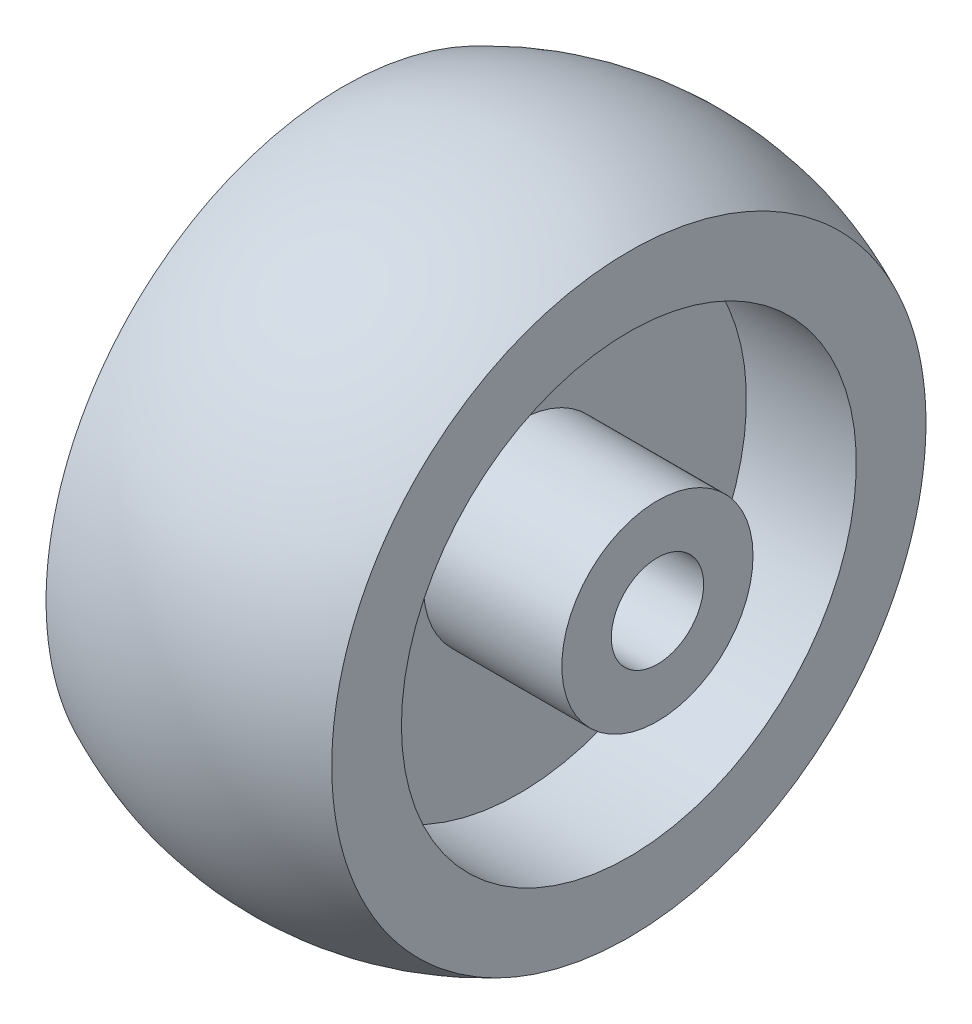
ISO-10303-21;
HEADER;
FILE_DESCRIPTION(('STEP AP214'),'2;1');
FILE_NAME('part.step','',(''),(''),'','','');
FILE_SCHEMA(('AUTOMOTIVE_DESIGN { 1 0 10303 214 1 1 1 1 }'));
ENDSEC;
DATA;
#1=APPLICATION_CONTEXT('core data for automotive mechanical design processes');
#2=APPLICATION_PROTOCOL_DEFINITION('international standard','automotive_design',2000,#1);
#3=PRODUCT_CONTEXT('',#1,'mechanical');
#4=PRODUCT('Part','Part','',(#3));
#5=PRODUCT_RELATED_PRODUCT_CATEGORY('part','',(#4));
#6=PRODUCT_DEFINITION_FORMATION('','',#4);
#7=PRODUCT_DEFINITION_CONTEXT('part definition',#1,'design');
#8=PRODUCT_DEFINITION('design','',#6,#7);
#9=PRODUCT_DEFINITION_SHAPE('','',#8);
#10=(LENGTH_UNIT() NAMED_UNIT(*) SI_UNIT(.MILLI.,.METRE.));
#11=(NAMED_UNIT(*) PLANE_ANGLE_UNIT() SI_UNIT($,.RADIAN.));
#12=(NAMED_UNIT(*) SI_UNIT($,.STERADIAN.) SOLID_ANGLE_UNIT());
#13=UNCERTAINTY_MEASURE_WITH_UNIT(LENGTH_MEASURE(1.E-05),#10,'distance_accuracy_value','');
#14=(GEOMETRIC_REPRESENTATION_CONTEXT(3) GLOBAL_UNCERTAINTY_ASSIGNED_CONTEXT((#13)) GLOBAL_UNIT_ASSIGNED_CONTEXT((#10,
#11,#12)) REPRESENTATION_CONTEXT('',''));
#15=CARTESIAN_POINT('',(0.,0.,0.));
#16=DIRECTION('',(0.,0.,1.));
#17=DIRECTION('',(1.,0.,0.));
#18=AXIS2_PLACEMENT_3D('',#15,#16,#17);
#19=CARTESIAN_POINT('',(-7.8,0.,0.));
#20=DIRECTION('',(1.,0.,0.));
#21=DIRECTION('',(0.,0.,-1.));
#22=AXIS2_PLACEMENT_3D('',#19,#20,#21);
#23=CYLINDRICAL_SURFACE('',#22,2.1);
#24=CARTESIAN_POINT('',(7.8,0.,0.));
#25=DIRECTION('',(1.,0.,0.));
#26=DIRECTION('',(0.,0.,-1.));
#27=AXIS2_PLACEMENT_3D('',#24,#25,#26);
#28=CIRCLE('',#27,2.1);
#29=CARTESIAN_POINT('',(7.8,0.,-2.1));
#30=VERTEX_POINT('',#29);
#31=EDGE_CURVE('E19',#30,#30,#28,.F.);
#32=ORIENTED_EDGE('',*,*,#31,.F.);
#33=EDGE_LOOP('',(#32));
#34=FACE_BOUND('',#33,.T.);
#35=CARTESIAN_POINT('',(-7.8,0.,0.));
#36=DIRECTION('',(1.,0.,0.));
#37=DIRECTION('',(0.,0.,-1.));
#38=AXIS2_PLACEMENT_3D('',#35,#36,#37);
#39=CIRCLE('',#38,2.1);
#40=CARTESIAN_POINT('',(-7.8,0.,-2.1));
#41=VERTEX_POINT('',#40);
#42=EDGE_CURVE('E105',#41,#41,#39,.F.);
#43=ORIENTED_EDGE('',*,*,#42,.T.);
#44=EDGE_LOOP('',(#43));
#45=FACE_BOUND('',#44,.T.);
#46=ADVANCED_FACE('F16',(#34,#45),#23,.F.);
#47=CARTESIAN_POINT('',(7.8,0.,0.));
#48=DIRECTION('',(1.,0.,0.));
#49=DIRECTION('',(0.,0.,-1.));
#50=AXIS2_PLACEMENT_3D('',#47,#48,#49);
#51=PLANE('',#50);
#52=ORIENTED_EDGE('',*,*,#31,.T.);
#53=EDGE_LOOP('',(#52));
#54=FACE_BOUND('',#53,.T.);
#55=CARTESIAN_POINT('',(7.8,0.,0.));
#56=DIRECTION('',(1.,0.,0.));
#57=DIRECTION('',(0.,0.,-1.));
#58=AXIS2_PLACEMENT_3D('',#55,#56,#57);
#59=CIRCLE('',#58,4.35);
#60=CARTESIAN_POINT('',(7.8,0.,-4.35));
#61=VERTEX_POINT('',#60);
#62=EDGE_CURVE('E103',#61,#61,#59,.F.);
#63=ORIENTED_EDGE('',*,*,#62,.F.);
#64=EDGE_LOOP('',(#63));
#65=FACE_BOUND('',#64,.T.);
#66=ADVANCED_FACE('F89',(#54,#65),#51,.T.);
#67=CARTESIAN_POINT('',(-7.8,0.,0.));
#68=DIRECTION('',(1.,0.,0.));
#69=DIRECTION('',(0.,0.,-1.));
#70=AXIS2_PLACEMENT_3D('',#67,#68,#69);
#71=PLANE('',#70);
#72=CARTESIAN_POINT('',(-7.8,0.,0.));
#73=DIRECTION('',(1.,0.,0.));
#74=DIRECTION('',(0.,0.,-1.));
#75=AXIS2_PLACEMENT_3D('',#72,#73,#74);
#76=CIRCLE('',#75,4.35);
#77=CARTESIAN_POINT('',(-7.8,0.,-4.35));
#78=VERTEX_POINT('',#77);
#79=EDGE_CURVE('E104',#78,#78,#76,.T.);
#80=ORIENTED_EDGE('',*,*,#79,.F.);
#81=EDGE_LOOP('',(#80));
#82=FACE_BOUND('',#81,.T.);
#83=ORIENTED_EDGE('',*,*,#42,.F.);
#84=EDGE_LOOP('',(#83));
#85=FACE_BOUND('',#84,.T.);
#86=ADVANCED_FACE('F86',(#82,#85),#71,.F.);
#87=CARTESIAN_POINT('',(1.5,0.,0.));
#88=DIRECTION('',(1.,0.,0.));
#89=DIRECTION('',(0.,0.,-1.));
#90=AXIS2_PLACEMENT_3D('',#87,#88,#89);
#91=CYLINDRICAL_SURFACE('',#90,4.35);
#92=ORIENTED_EDGE('',*,*,#62,.T.);
#93=EDGE_LOOP('',(#92));
#94=FACE_BOUND('',#93,.T.);
#95=CARTESIAN_POINT('',(1.5,0.,0.));
#96=DIRECTION('',(1.,0.,0.));
#97=DIRECTION('',(0.,0.,-1.));
#98=AXIS2_PLACEMENT_3D('',#95,#96,#97);
#99=CIRCLE('',#98,4.35);
#100=CARTESIAN_POINT('',(1.5,0.,-4.35));
#101=VERTEX_POINT('',#100);
#102=EDGE_CURVE('E108',#101,#101,#99,.F.);
#103=ORIENTED_EDGE('',*,*,#102,.F.);
#104=EDGE_LOOP('',(#103));
#105=FACE_BOUND('',#104,.T.);
#106=ADVANCED_FACE('F82',(#94,#105),#91,.T.);
#107=CARTESIAN_POINT('',(-7.8,0.,0.));
#108=DIRECTION('',(1.,0.,0.));
#109=DIRECTION('',(0.,0.,-1.));
#110=AXIS2_PLACEMENT_3D('',#107,#108,#109);
#111=CYLINDRICAL_SURFACE('',#110,4.35);
#112=CARTESIAN_POINT('',(-1.5,0.,0.));
#113=DIRECTION('',(1.,0.,0.));
#114=DIRECTION('',(0.,0.,-1.));
#115=AXIS2_PLACEMENT_3D('',#112,#113,#114);
#116=CIRCLE('',#115,4.35);
#117=CARTESIAN_POINT('',(-1.5,0.,-4.35));
#118=VERTEX_POINT('',#117);
#119=EDGE_CURVE('E114',#118,#118,#116,.F.);
#120=ORIENTED_EDGE('',*,*,#119,.T.);
#121=EDGE_LOOP('',(#120));
#122=FACE_BOUND('',#121,.T.);
#123=ORIENTED_EDGE('',*,*,#79,.T.);
#124=EDGE_LOOP('',(#123));
#125=FACE_BOUND('',#124,.T.);
#126=ADVANCED_FACE('F78',(#122,#125),#111,.T.);
#127=CARTESIAN_POINT('',(1.5,0.,0.));
#128=DIRECTION('',(1.,0.,0.));
#129=DIRECTION('',(0.,0.,-1.));
#130=AXIS2_PLACEMENT_3D('',#127,#128,#129);
#131=PLANE('',#130);
#132=ORIENTED_EDGE('',*,*,#102,.T.);
#133=EDGE_LOOP('',(#132));
#134=FACE_BOUND('',#133,.T.);
#135=CARTESIAN_POINT('',(1.5,0.,0.));
#136=DIRECTION('',(-1.,0.,0.));
#137=DIRECTION('',(0.,0.,1.));
#138=AXIS2_PLACEMENT_3D('',#135,#136,#137);
#139=CIRCLE('',#138,10.35);
#140=CARTESIAN_POINT('',(1.5,0.,10.35));
#141=VERTEX_POINT('',#140);
#142=EDGE_CURVE('E117',#141,#141,#139,.F.);
#143=ORIENTED_EDGE('',*,*,#142,.T.);
#144=EDGE_LOOP('',(#143));
#145=FACE_BOUND('',#144,.T.);
#146=ADVANCED_FACE('F74',(#134,#145),#131,.T.);
#147=CARTESIAN_POINT('',(-1.5,0.,0.));
#148=DIRECTION('',(1.,0.,0.));
#149=DIRECTION('',(0.,0.,-1.));
#150=AXIS2_PLACEMENT_3D('',#147,#148,#149);
#151=PLANE('',#150);
#152=CARTESIAN_POINT('',(-1.5,0.,0.));
#153=DIRECTION('',(-1.,0.,0.));
#154=DIRECTION('',(0.,0.,1.));
#155=AXIS2_PLACEMENT_3D('',#152,#153,#154);
#156=CIRCLE('',#155,10.35);
#157=CARTESIAN_POINT('',(-1.5,0.,10.35));
#158=VERTEX_POINT('',#157);
#159=EDGE_CURVE('E120',#158,#158,#156,.T.);
#160=ORIENTED_EDGE('',*,*,#159,.T.);
#161=EDGE_LOOP('',(#160));
#162=FACE_BOUND('',#161,.T.);
#163=ORIENTED_EDGE('',*,*,#119,.F.);
#164=EDGE_LOOP('',(#163));
#165=FACE_BOUND('',#164,.T.);
#166=ADVANCED_FACE('F70',(#162,#165),#151,.F.);
#167=CARTESIAN_POINT('',(6.5,0.,0.));
#168=DIRECTION('',(-1.,0.,0.));
#169=DIRECTION('',(0.,0.,1.));
#170=AXIS2_PLACEMENT_3D('',#167,#168,#169);
#171=CYLINDRICAL_SURFACE('',#170,10.35);
#172=ORIENTED_EDGE('',*,*,#142,.F.);
#173=EDGE_LOOP('',(#172));
#174=FACE_BOUND('',#173,.T.);
#175=CARTESIAN_POINT('',(6.5,0.,0.));
#176=DIRECTION('',(-1.,0.,0.));
#177=DIRECTION('',(0.,0.,1.));
#178=AXIS2_PLACEMENT_3D('',#175,#176,#177);
#179=CIRCLE('',#178,10.35);
#180=CARTESIAN_POINT('',(6.5,0.,10.35));
#181=VERTEX_POINT('',#180);
#182=EDGE_CURVE('E44',#181,#181,#179,.T.);
#183=ORIENTED_EDGE('',*,*,#182,.F.);
#184=EDGE_LOOP('',(#183));
#185=FACE_BOUND('',#184,.T.);
#186=ADVANCED_FACE('F66',(#174,#185),#171,.F.);
#187=CARTESIAN_POINT('',(-1.5,0.,0.));
#188=DIRECTION('',(-1.,0.,0.));
#189=DIRECTION('',(0.,0.,1.));
#190=AXIS2_PLACEMENT_3D('',#187,#188,#189);
#191=CYLINDRICAL_SURFACE('',#190,10.35);
#192=CARTESIAN_POINT('',(-6.5,0.,0.));
#193=DIRECTION('',(-1.,0.,0.));
#194=DIRECTION('',(0.,0.,1.));
#195=AXIS2_PLACEMENT_3D('',#192,#193,#194);
#196=CIRCLE('',#195,10.35);
#197=CARTESIAN_POINT('',(-6.5,0.,10.35));
#198=VERTEX_POINT('',#197);
#199=EDGE_CURVE('E41',#198,#198,#196,.T.);
#200=ORIENTED_EDGE('',*,*,#199,.T.);
#201=EDGE_LOOP('',(#200));
#202=FACE_BOUND('',#201,.T.);
#203=ORIENTED_EDGE('',*,*,#159,.F.);
#204=EDGE_LOOP('',(#203));
#205=FACE_BOUND('',#204,.T.);
#206=ADVANCED_FACE('F61',(#202,#205),#191,.F.);
#207=CARTESIAN_POINT('',(6.5,0.,0.));
#208=DIRECTION('',(1.,0.,0.));
#209=DIRECTION('',(0.,0.,-1.));
#210=AXIS2_PLACEMENT_3D('',#207,#208,#209);
#211=PLANE('',#210);
#212=ORIENTED_EDGE('',*,*,#182,.T.);
#213=EDGE_LOOP('',(#212));
#214=FACE_BOUND('',#213,.T.);
#215=CARTESIAN_POINT('',(6.5,0.,13.5185058345958));
#216=CARTESIAN_POINT('',(6.5,0.379806911461447,13.5185085597624));
#217=CARTESIAN_POINT('',(6.5,0.759569101070745,13.5024930522277));
#218=CARTESIAN_POINT('',(6.5,1.51652095486907,13.4385428233857));
#219=CARTESIAN_POINT('',(6.5,1.89370991590769,13.3905997048827));
#220=CARTESIAN_POINT('',(6.5,2.64310845553591,13.2630544397297));
#221=CARTESIAN_POINT('',(6.5,3.01531223636152,13.1834182657743));
#222=CARTESIAN_POINT('',(6.5,3.75168268327145,12.9930555182386));
#223=CARTESIAN_POINT('',(6.5,4.11584937840309,12.8823290570434));
#224=CARTESIAN_POINT('',(6.5,4.83337890204307,12.6306345735653));
#225=CARTESIAN_POINT('',(6.5,5.18674687608476,12.4896812192764));
#226=CARTESIAN_POINT('',(6.5,5.88035646543985,12.1785011950992));
#227=CARTESIAN_POINT('',(6.5,6.22059787338108,12.0082740629784));
#228=CARTESIAN_POINT('',(6.5,6.88544383430114,11.6398055792623));
#229=CARTESIAN_POINT('',(6.5,7.21005235048014,11.4415713785936));
#230=CARTESIAN_POINT('',(6.5,7.84141690901289,11.0184658682828));
#231=CARTESIAN_POINT('',(6.5,8.14817302120484,10.7935946628545));
#232=CARTESIAN_POINT('',(6.5,8.74168537595421,10.3187875647755));
#233=CARTESIAN_POINT('',(6.5,9.02843948952077,10.0688490108651));
#234=CARTESIAN_POINT('',(6.5,9.57987372930437,9.54570372812803));
#235=CARTESIAN_POINT('',(6.5,9.84455383315121,9.27249697572157));
#236=CARTESIAN_POINT('',(6.5,10.3499679394998,8.70474670550341));
#237=CARTESIAN_POINT('',(6.5,10.5907010095678,8.41020235763375));
#238=CARTESIAN_POINT('',(6.5,11.0464977522916,7.80188047401988));
#239=CARTESIAN_POINT('',(6.5,11.261561429973,7.48810294204118));
#240=CARTESIAN_POINT('',(6.5,11.6644866682511,6.84355148436636));
#241=CARTESIAN_POINT('',(6.5,11.8523487338855,6.51277787438177));
#242=CARTESIAN_POINT('',(6.5,12.1995399173937,5.83658050195065));
#243=CARTESIAN_POINT('',(6.5,12.3588690347416,5.49115673923408));
#244=CARTESIAN_POINT('',(6.5,12.6478612867872,4.78811554173684));
#245=CARTESIAN_POINT('',(6.5,12.7775244814995,4.43049813162581));
#246=CARTESIAN_POINT('',(6.5,13.0062634754558,3.70561141725477));
#247=CARTESIAN_POINT('',(6.5,13.1053392747349,3.3383421130059));
#248=CARTESIAN_POINT('',(6.5,13.2721992691959,2.59676196050808));
#249=CARTESIAN_POINT('',(6.5,13.3399834045956,2.22245109880775));
#250=CARTESIAN_POINT('',(6.5,13.4437778865945,1.46944964432797));
#251=CARTESIAN_POINT('',(6.5,13.4797882332029,1.09075905154978));
#252=CARTESIAN_POINT('',(6.5,13.5197790892455,0.331691088376443));
#253=CARTESIAN_POINT('',(6.5,13.523759656473,-0.0486862789739143));
#254=CARTESIAN_POINT('',(6.5,13.499662806145,-0.808424220024645));
#255=CARTESIAN_POINT('',(6.5,13.4715853886284,-1.18778479372625));
#256=CARTESIAN_POINT('',(6.5,13.3835721656221,-1.94279226751681));
#257=CARTESIAN_POINT('',(6.5,13.323636348225,-2.31843916621769));
#258=CARTESIAN_POINT('',(6.5,13.172332425331,-3.06334852481618));
#259=CARTESIAN_POINT('',(6.5,13.0809643197924,-3.43261098470534));
#260=CARTESIAN_POINT('',(6.5,12.8674452794651,-4.16212661900159));
#261=CARTESIAN_POINT('',(6.5,12.7452943121522,-4.5223797838893));
#262=CARTESIAN_POINT('',(6.5,12.4710780171183,-5.2313152365744));
#263=CARTESIAN_POINT('',(6.50000000000001,12.3190126893819,-5.57999752436586));
#264=CARTESIAN_POINT('',(6.50000000000001,11.9860488223995,-6.26331218654353));
#265=CARTESIAN_POINT('',(6.5,11.8051502925499,-6.59794456550847));
#266=CARTESIAN_POINT('',(6.5,11.4158060666035,-7.2507804937492));
#267=CARTESIAN_POINT('',(6.5,11.2073603705269,-7.56898404303702));
#268=CARTESIAN_POINT('',(6.5,10.7644038265081,-8.18669994941122));
#269=CARTESIAN_POINT('',(6.5,10.5298929891241,-8.48621231406869));
#270=CARTESIAN_POINT('',(6.5,10.0364733246882,-9.06441663895482));
#271=CARTESIAN_POINT('',(6.5,9.77756449763924,-9.3431085991859));
#272=CARTESIAN_POINT('',(6.5,9.23718950265416,-9.87769081988942));
#273=CARTESIAN_POINT('',(6.5,8.95572333162275,-10.133581077233));
#274=CARTESIAN_POINT('',(6.5,8.37223473509459,-10.6207406230468));
#275=CARTESIAN_POINT('',(6.5,8.07021230959269,-10.8520099115107));
#276=CARTESIAN_POINT('',(6.5,7.44775836164599,-11.2882833622149));
#277=CARTESIAN_POINT('',(6.5,7.12732683679378,-11.4932875210203));
#278=CARTESIAN_POINT('',(6.5,6.47033280250998,-11.8755732200228));
#279=CARTESIAN_POINT('',(6.5,6.13377029307782,-12.0528547602189));
#280=CARTESIAN_POINT('',(6.5,5.44690706249277,-12.3784348493407));
#281=CARTESIAN_POINT('',(6.5,5.09660634192884,-12.5267333995089));
#282=CARTESIAN_POINT('',(6.5,4.38475710388951,-12.7932932041288));
#283=CARTESIAN_POINT('',(6.5,4.02320858641497,-12.9115544585829));
#284=CARTESIAN_POINT('',(6.5,3.29143416451113,-13.1171989004684));
#285=CARTESIAN_POINT('',(6.5,2.92120826047298,-13.2045820892918));
#286=CARTESIAN_POINT('',(6.5,2.17471113395502,-13.3478491652301));
#287=CARTESIAN_POINT('',(6.49999999999999,1.79843991147536,-13.4037330523458));
#288=CARTESIAN_POINT('',(6.49999999999999,1.04252721090337,-13.4836042239552));
#289=CARTESIAN_POINT('',(6.5,0.66288573281105,-13.5075915084488));
#290=CARTESIAN_POINT('',(6.5,-0.0970684556650079,-13.5234989395798));
#291=CARTESIAN_POINT('',(6.5,-0.477381166048759,-13.5154190862164));
#292=CARTESIAN_POINT('',(6.5,-1.23597404083139,-13.4672496834783));
#293=CARTESIAN_POINT('',(6.5,-1.61425420513865,-13.4271601326606));
#294=CARTESIAN_POINT('',(6.5,-2.36609262504146,-13.315256345887));
#295=CARTESIAN_POINT('',(6.5,-2.73965088063663,-13.2434421099287));
#296=CARTESIAN_POINT('',(6.5,-3.47938972346491,-13.0685995053572));
#297=CARTESIAN_POINT('',(6.5,-3.84557031038173,-12.9655711354059));
#298=CARTESIAN_POINT('',(6.5,-4.56795047441888,-12.7290327339739));
#299=CARTESIAN_POINT('',(6.5,-4.92415005153956,-12.5955227024942));
#300=CARTESIAN_POINT('',(6.5,-5.62403578427792,-12.2989701739044));
#301=CARTESIAN_POINT('',(6.5,-5.96772194153201,-12.1359276806562));
#302=CARTESIAN_POINT('',(6.5,-6.64013748120895,-11.7814693511494));
#303=CARTESIAN_POINT('',(6.5,-6.96886686363555,-11.5900535148978));
#304=CARTESIAN_POINT('',(6.5,-7.60903174113298,-11.1802093792606));
#305=CARTESIAN_POINT('',(6.5,-7.92046723857685,-10.9617810835817));
#306=CARTESIAN_POINT('',(6.5,-8.523830275931,-10.4994649020308));
#307=CARTESIAN_POINT('',(6.5,-8.81575781583902,-10.2555770161559));
#308=CARTESIAN_POINT('',(6.5,-9.37802962303564,-9.74407544655069));
#309=CARTESIAN_POINT('',(6.5,-9.64837388158156,-9.47646175320992));
#310=CARTESIAN_POINT('',(6.5,-10.1655570082065,-8.91941122676359));
#311=CARTESIAN_POINT('',(6.5,-10.4123958762684,-8.62997439364207));
#312=CARTESIAN_POINT('',(6.5,-10.8808134209862,-8.03133521344798));
#313=CARTESIAN_POINT('',(6.5,-11.10239208941,-7.72213285993401));
#314=CARTESIAN_POINT('',(6.5,-11.5187138486258,-7.08616096956507));
#315=CARTESIAN_POINT('',(6.5,-11.7134569394315,-6.75939143271908));
#316=CARTESIAN_POINT('',(6.5,-12.0747228443797,-6.09060866740072));
#317=CARTESIAN_POINT('',(6.5,-12.2412456883388,-5.74859545503478));
#318=CARTESIAN_POINT('',(6.5,-12.544887473752,-5.0517565240315));
#319=CARTESIAN_POINT('',(6.49999999999999,-12.6820064152451,-4.69693080541112));
#320=CARTESIAN_POINT('',(6.49999999999999,-12.9258655178524,-3.97698959185329));
#321=CARTESIAN_POINT('',(6.5,-13.0326056903209,-3.61187410076175));
#322=CARTESIAN_POINT('',(6.5,-13.2149484660262,-2.87394896267808));
#323=CARTESIAN_POINT('',(6.5,-13.2905510692252,-2.5011393156766));
#324=CARTESIAN_POINT('',(6.5,-13.4100813258564,-1.75047563663462));
#325=CARTESIAN_POINT('',(6.5,-13.454008922135,-1.37262159549342));
#326=CARTESIAN_POINT('',(6.5,-13.5098766430744,-0.614556108415204));
#327=CARTESIAN_POINT('',(6.5,-13.521816767726,-0.234344662477521));
#328=CARTESIAN_POINT('',(6.5,-13.513624666073,0.525731826963344));
#329=CARTESIAN_POINT('',(6.5,-13.4934925010417,0.905596871126931));
#330=CARTESIAN_POINT('',(6.5,-13.4212990622208,1.662280677891));
#331=CARTESIAN_POINT('',(6.5,-13.3692377883944,2.03909944048797));
#332=CARTESIAN_POINT('',(6.5,-13.2335561179387,2.78701249119847));
#333=CARTESIAN_POINT('',(6.5,-13.1499356574644,3.15810676772963));
#334=CARTESIAN_POINT('',(6.5,-12.9517301185553,3.89193179369587));
#335=CARTESIAN_POINT('',(6.5,-12.8371450406914,4.25466254328512));
#336=CARTESIAN_POINT('',(6.5,-12.5778224884815,4.96918836027674));
#337=CARTESIAN_POINT('',(6.5,-12.4330844542696,5.32098322448734));
#338=CARTESIAN_POINT('',(6.5,-12.1144862858634,6.01112914518045));
#339=CARTESIAN_POINT('',(6.5,-11.9406261459674,6.34948019903089));
#340=CARTESIAN_POINT('',(6.5,-11.5650271980198,7.01031998182969));
#341=CARTESIAN_POINT('',(6.5,-11.3632894752858,7.33280932763656));
#342=CARTESIAN_POINT('',(6.5,-10.9333646057217,7.95964687771318));
#343=CARTESIAN_POINT('',(6.5,-10.7051774856958,8.26399510036693));
#344=CARTESIAN_POINT('',(6.5,-10.224001461122,8.85235581370665));
#345=CARTESIAN_POINT('',(6.5,-9.97101519472992,9.13637046194671));
#346=CARTESIAN_POINT('',(6.5,-9.44201768891213,9.68208203179398));
#347=CARTESIAN_POINT('',(6.5,-9.16600635941072,9.94377886608421));
#348=CARTESIAN_POINT('',(6.5,-8.59284817729927,10.4430572188319));
#349=CARTESIAN_POINT('',(6.5,-8.29569595452977,10.6806325725432));
#350=CARTESIAN_POINT('',(6.5,-7.68243656620803,11.1298988549721));
#351=CARTESIAN_POINT('',(6.5,-7.36632970005091,11.3415901923762));
#352=CARTESIAN_POINT('',(6.5,-6.71724667041116,11.7376835537723));
#353=CARTESIAN_POINT('',(6.5,-6.38426240954859,11.9220723090415));
#354=CARTESIAN_POINT('',(6.5,-5.70393675583766,12.2621258572283));
#355=CARTESIAN_POINT('',(6.5,-5.35659531109594,12.4177905463131));
#356=CARTESIAN_POINT('',(6.5,-4.65040099603591,12.6991365170267));
#357=CARTESIAN_POINT('',(6.5,-4.29156090683821,12.8248498628806));
#358=CARTESIAN_POINT('',(6.5,-3.5646893116592,13.0455836954925));
#359=CARTESIAN_POINT('',(6.5,-3.19666024823554,13.1406122470649));
#360=CARTESIAN_POINT('',(6.5,-2.3613895902655,13.3191114615836));
#361=CARTESIAN_POINT('',(6.5,-1.89225004251077,13.3938208957318));
#362=CARTESIAN_POINT('',(6.5,-0.948717079867951,13.4935163805692));
#363=CARTESIAN_POINT('',(6.5,-0.474323664979852,13.5185024312585));
#364=CARTESIAN_POINT('',(6.5,0.,13.5185058345958));
#365=B_SPLINE_CURVE_WITH_KNOTS('',3,(#215,#216,#217,#218,#219,#220,#221,#222,#223,#224,#225,
#226,#227,#228,#229,#230,#231,#232,#233,#234,#235,#236,#237,#238,#239,#240,#241,#242,#243,#244,
#245,#246,#247,#248,#249,#250,#251,#252,#253,#254,#255,#256,#257,#258,#259,#260,#261,#262,#263,
#264,#265,#266,#267,#268,#269,#270,#271,#272,#273,#274,#275,#276,#277,#278,#279,#280,#281,#282,
#283,#284,#285,#286,#287,#288,#289,#290,#291,#292,#293,#294,#295,#296,#297,#298,#299,#300,#301,
#302,#303,#304,#305,#306,#307,#308,#309,#310,#311,#312,#313,#314,#315,#316,#317,#318,#319,#320,
#321,#322,#323,#324,#325,#326,#327,#328,#329,#330,#331,#332,#333,#334,#335,#336,#337,#338,#339,
#340,#341,#342,#343,#344,#345,#346,#347,#348,#349,#350,#351,#352,#353,#354,#355,#356,#357,#358,
#359,#360,#361,#362,#363,#364),.UNSPECIFIED.,.T.,.F.,(4,2,2,2,2,2,2,2,2,2,2,2,2,2,2,2,2,2,2,2,2,
2,2,2,2,2,2,2,2,2,2,2,2,2,2,2,2,2,2,2,2,2,2,2,2,2,2,2,2,2,2,2,2,2,2,2,2,2,2,2,2,2,2,2,2,2,2,2,2,
2,2,2,2,2,4),(0.,1.13900641336215,2.27831251213763,3.41884514327066,4.55937365165679,
5.69934995107063,6.83934425234558,7.97904800794707,9.11874730475418,10.258567725382,
11.3983893011105,12.5382552410946,13.6781209579129,14.8179655087457,15.9578100805894,
17.0976523464884,18.2374946110732,19.3773390533007,20.5171834952021,21.6570258804093,
22.7968682642334,23.9367110740818,25.0765538854387,26.216397901124,27.3562419173937,
28.4960855621971,29.635929206167,30.7757723884268,31.915615570554,33.0554589090891,
34.1953022479101,35.3351457357922,36.4749892237143,37.6148326627701,38.754676101737,
39.894519489321,41.0343628768745,42.174206264428,43.3140496520121,44.4538930909789,
45.5937365300348,46.7335800179569,47.873423505839,49.01326684466,50.1531101831951,
51.2929533653223,52.4327965475821,53.5726401915519,54.7124838363554,55.8523278526251,
56.9921718683104,58.1320146796673,59.2718574895156,60.4116998733398,61.5515422585469,
62.6913867004484,63.8312311426759,64.9710734072607,66.1109156731597,67.2507602450034,
68.3906047958362,69.5304705126545,70.6703364526386,71.8101580283671,72.9499784489949,
74.089677745802,75.2293815014035,76.3693758026785,77.5093521020923,78.6498806104784,
79.7904132416115,80.9297193403869,82.0687257537491,83.4911793219125,84.913632890076),.UNSPECIFIED.);
#366=CARTESIAN_POINT('',(6.5,0.,13.5185058345958));
#367=VERTEX_POINT('',#366);
#368=EDGE_CURVE('E25',#367,#367,#365,.T.);
#369=ORIENTED_EDGE('',*,*,#368,.F.);
#370=EDGE_LOOP('',(#369));
#371=FACE_BOUND('',#370,.T.);
#372=ADVANCED_FACE('F57',(#214,#371),#211,.T.);
#373=CARTESIAN_POINT('',(-6.5,0.,0.));
#374=DIRECTION('',(1.,0.,0.));
#375=DIRECTION('',(0.,0.,-1.));
#376=AXIS2_PLACEMENT_3D('',#373,#374,#375);
#377=PLANE('',#376);
#378=CARTESIAN_POINT('',(-6.5,0.,13.5185058345958));
#379=CARTESIAN_POINT('',(-6.5,-0.379806911461455,13.5185085597624));
#380=CARTESIAN_POINT('',(-6.5,-0.759569101070753,13.5024930522277));
#381=CARTESIAN_POINT('',(-6.5,-1.51652095486908,13.4385428233857));
#382=CARTESIAN_POINT('',(-6.5,-1.8937099159077,13.3905997048827));
#383=CARTESIAN_POINT('',(-6.5,-2.64310845553591,13.2630544397297));
#384=CARTESIAN_POINT('',(-6.5,-3.01531223636153,13.1834182657743));
#385=CARTESIAN_POINT('',(-6.5,-3.75168268327145,12.9930555182386));
#386=CARTESIAN_POINT('',(-6.49999999999999,-4.1158493784031,12.8823290570434));
#387=CARTESIAN_POINT('',(-6.49999999999999,-4.83337890204307,12.6306345735653));
#388=CARTESIAN_POINT('',(-6.5,-5.18674687608477,12.4896812192764));
#389=CARTESIAN_POINT('',(-6.5,-5.88035646543986,12.1785011950992));
#390=CARTESIAN_POINT('',(-6.5,-6.22059787338109,12.0082740629784));
#391=CARTESIAN_POINT('',(-6.5,-6.88544383430114,11.6398055792623));
#392=CARTESIAN_POINT('',(-6.5,-7.21005235048014,11.4415713785936));
#393=CARTESIAN_POINT('',(-6.5,-7.84141690901289,11.0184658682828));
#394=CARTESIAN_POINT('',(-6.5,-8.14817302120484,10.7935946628545));
#395=CARTESIAN_POINT('',(-6.5,-8.74168537595421,10.3187875647755));
#396=CARTESIAN_POINT('',(-6.5,-9.02843948952078,10.0688490108651));
#397=CARTESIAN_POINT('',(-6.5,-9.57987372930438,9.54570372812803));
#398=CARTESIAN_POINT('',(-6.5,-9.84455383315122,9.27249697572157));
#399=CARTESIAN_POINT('',(-6.5,-10.3499679394998,8.7047467055034));
#400=CARTESIAN_POINT('',(-6.5,-10.5907010095678,8.41020235763375));
#401=CARTESIAN_POINT('',(-6.5,-11.0464977522916,7.80188047401987));
#402=CARTESIAN_POINT('',(-6.5,-11.261561429973,7.48810294204118));
#403=CARTESIAN_POINT('',(-6.5,-11.6644866682511,6.84355148436636));
#404=CARTESIAN_POINT('',(-6.5,-11.8523487338855,6.51277787438176));
#405=CARTESIAN_POINT('',(-6.5,-12.1995399173937,5.83658050195064));
#406=CARTESIAN_POINT('',(-6.5,-12.3588690347416,5.49115673923407));
#407=CARTESIAN_POINT('',(-6.5,-12.6478612867872,4.78811554173684));
#408=CARTESIAN_POINT('',(-6.5,-12.7775244814995,4.4304981316258));
#409=CARTESIAN_POINT('',(-6.5,-13.0062634754558,3.70561141725477));
#410=CARTESIAN_POINT('',(-6.49999999999999,-13.1053392747349,3.3383421130059));
#411=CARTESIAN_POINT('',(-6.49999999999999,-13.272199269196,2.59676196050807));
#412=CARTESIAN_POINT('',(-6.5,-13.3399834045956,2.22245109880774));
#413=CARTESIAN_POINT('',(-6.5,-13.4437778865945,1.46944964432797));
#414=CARTESIAN_POINT('',(-6.5,-13.4797882332029,1.09075905154978));
#415=CARTESIAN_POINT('',(-6.5,-13.5197790892455,0.33169108837644));
#416=CARTESIAN_POINT('',(-6.5,-13.523759656473,-0.0486862789739173));
#417=CARTESIAN_POINT('',(-6.5,-13.499662806145,-0.808424220024648));
#418=CARTESIAN_POINT('',(-6.5,-13.4715853886284,-1.18778479372625));
#419=CARTESIAN_POINT('',(-6.5,-13.3835721656221,-1.94279226751681));
#420=CARTESIAN_POINT('',(-6.5,-13.323636348225,-2.3184391662177));
#421=CARTESIAN_POINT('',(-6.5,-13.172332425331,-3.06334852481619));
#422=CARTESIAN_POINT('',(-6.5,-13.0809643197924,-3.43261098470534));
#423=CARTESIAN_POINT('',(-6.5,-12.8674452794651,-4.1621266190016));
#424=CARTESIAN_POINT('',(-6.5,-12.7452943121522,-4.52237978388931));
#425=CARTESIAN_POINT('',(-6.5,-12.4710780171183,-5.23131523657441));
#426=CARTESIAN_POINT('',(-6.5,-12.319012689382,-5.57999752436587));
#427=CARTESIAN_POINT('',(-6.5,-11.9860488223995,-6.26331218654354));
#428=CARTESIAN_POINT('',(-6.5,-11.8051502925499,-6.59794456550848));
#429=CARTESIAN_POINT('',(-6.5,-11.4158060666035,-7.25078049374921));
#430=CARTESIAN_POINT('',(-6.5,-11.2073603705269,-7.56898404303703));
#431=CARTESIAN_POINT('',(-6.5,-10.7644038265081,-8.18669994941123));
#432=CARTESIAN_POINT('',(-6.5,-10.5298929891241,-8.48621231406869));
#433=CARTESIAN_POINT('',(-6.5,-10.0364733246882,-9.06441663895482));
#434=CARTESIAN_POINT('',(-6.49999999999999,-9.77756449763924,-9.34310859918591));
#435=CARTESIAN_POINT('',(-6.49999999999999,-9.23718950265415,-9.87769081988943));
#436=CARTESIAN_POINT('',(-6.5,-8.95572333162274,-10.133581077233));
#437=CARTESIAN_POINT('',(-6.5,-8.37223473509458,-10.6207406230468));
#438=CARTESIAN_POINT('',(-6.5,-8.07021230959269,-10.8520099115107));
#439=CARTESIAN_POINT('',(-6.5,-7.44775836164599,-11.2882833622149));
#440=CARTESIAN_POINT('',(-6.5,-7.12732683679378,-11.4932875210203));
#441=CARTESIAN_POINT('',(-6.5,-6.47033280250997,-11.8755732200228));
#442=CARTESIAN_POINT('',(-6.5,-6.13377029307782,-12.0528547602189));
#443=CARTESIAN_POINT('',(-6.5,-5.44690706249276,-12.3784348493407));
#444=CARTESIAN_POINT('',(-6.5,-5.09660634192884,-12.5267333995089));
#445=CARTESIAN_POINT('',(-6.5,-4.38475710388951,-12.7932932041288));
#446=CARTESIAN_POINT('',(-6.5,-4.02320858641497,-12.9115544585829));
#447=CARTESIAN_POINT('',(-6.5,-3.29143416451113,-13.1171989004684));
#448=CARTESIAN_POINT('',(-6.5,-2.92120826047298,-13.2045820892918));
#449=CARTESIAN_POINT('',(-6.5,-2.17471113395501,-13.3478491652301));
#450=CARTESIAN_POINT('',(-6.49999999999999,-1.79843991147536,-13.4037330523458));
#451=CARTESIAN_POINT('',(-6.49999999999999,-1.04252721090337,-13.4836042239552));
#452=CARTESIAN_POINT('',(-6.5,-0.662885732811046,-13.5075915084488));
#453=CARTESIAN_POINT('',(-6.5,0.097068455665012,-13.5234989395798));
#454=CARTESIAN_POINT('',(-6.5,0.477381166048763,-13.5154190862164));
#455=CARTESIAN_POINT('',(-6.5,1.2359740408314,-13.4672496834783));
#456=CARTESIAN_POINT('',(-6.5,1.61425420513866,-13.4271601326606));
#457=CARTESIAN_POINT('',(-6.5,2.36609262504146,-13.315256345887));
#458=CARTESIAN_POINT('',(-6.5,2.73965088063664,-13.2434421099287));
#459=CARTESIAN_POINT('',(-6.5,3.47938972346492,-13.0685995053572));
#460=CARTESIAN_POINT('',(-6.5,3.84557031038174,-12.9655711354059));
#461=CARTESIAN_POINT('',(-6.5,4.56795047441888,-12.7290327339739));
#462=CARTESIAN_POINT('',(-6.5,4.92415005153956,-12.5955227024942));
#463=CARTESIAN_POINT('',(-6.5,5.62403578427792,-12.2989701739044));
#464=CARTESIAN_POINT('',(-6.5,5.96772194153202,-12.1359276806562));
#465=CARTESIAN_POINT('',(-6.5,6.64013748120896,-11.7814693511493));
#466=CARTESIAN_POINT('',(-6.5,6.96886686363556,-11.5900535148978));
#467=CARTESIAN_POINT('',(-6.5,7.60903174113299,-11.1802093792606));
#468=CARTESIAN_POINT('',(-6.5,7.92046723857685,-10.9617810835817));
#469=CARTESIAN_POINT('',(-6.5,8.52383027593101,-10.4994649020308));
#470=CARTESIAN_POINT('',(-6.5,8.81575781583903,-10.2555770161559));
#471=CARTESIAN_POINT('',(-6.5,9.37802962303564,-9.74407544655068));
#472=CARTESIAN_POINT('',(-6.5,9.64837388158157,-9.47646175320992));
#473=CARTESIAN_POINT('',(-6.5,10.1655570082065,-8.91941122676359));
#474=CARTESIAN_POINT('',(-6.5,10.4123958762684,-8.62997439364206));
#475=CARTESIAN_POINT('',(-6.5,10.8808134209862,-8.03133521344797));
#476=CARTESIAN_POINT('',(-6.5,11.10239208941,-7.72213285993401));
#477=CARTESIAN_POINT('',(-6.5,11.5187138486258,-7.08616096956506));
#478=CARTESIAN_POINT('',(-6.5,11.7134569394315,-6.75939143271908));
#479=CARTESIAN_POINT('',(-6.5,12.0747228443797,-6.09060866740071));
#480=CARTESIAN_POINT('',(-6.50000000000001,12.2412456883388,-5.74859545503477));
#481=CARTESIAN_POINT('',(-6.5,12.544887473752,-5.05175652403149));
#482=CARTESIAN_POINT('',(-6.49999999999998,12.6820064152451,-4.69693080541111));
#483=CARTESIAN_POINT('',(-6.49999999999998,12.9258655178524,-3.97698959185328));
#484=CARTESIAN_POINT('',(-6.5,13.0326056903209,-3.61187410076174));
#485=CARTESIAN_POINT('',(-6.50000000000001,13.2149484660262,-2.87394896267807));
#486=CARTESIAN_POINT('',(-6.5,13.2905510692253,-2.50113931567659));
#487=CARTESIAN_POINT('',(-6.5,13.4100813258564,-1.75047563663461));
#488=CARTESIAN_POINT('',(-6.5,13.454008922135,-1.37262159549341));
#489=CARTESIAN_POINT('',(-6.5,13.5098766430744,-0.614556108415194));
#490=CARTESIAN_POINT('',(-6.5,13.521816767726,-0.234344662477511));
#491=CARTESIAN_POINT('',(-6.5,13.513624666073,0.525731826963355));
#492=CARTESIAN_POINT('',(-6.5,13.4934925010417,0.905596871126942));
#493=CARTESIAN_POINT('',(-6.5,13.4212990622208,1.66228067789101));
#494=CARTESIAN_POINT('',(-6.5,13.3692377883944,2.03909944048798));
#495=CARTESIAN_POINT('',(-6.5,13.2335561179387,2.78701249119848));
#496=CARTESIAN_POINT('',(-6.5,13.1499356574643,3.15810676772964));
#497=CARTESIAN_POINT('',(-6.5,12.9517301185553,3.89193179369588));
#498=CARTESIAN_POINT('',(-6.5,12.8371450406914,4.25466254328513));
#499=CARTESIAN_POINT('',(-6.5,12.5778224884815,4.96918836027676));
#500=CARTESIAN_POINT('',(-6.5,12.4330844542696,5.32098322448735));
#501=CARTESIAN_POINT('',(-6.5,12.1144862858634,6.01112914518046));
#502=CARTESIAN_POINT('',(-6.5,11.9406261459674,6.3494801990309));
#503=CARTESIAN_POINT('',(-6.5,11.5650271980198,7.0103199818297));
#504=CARTESIAN_POINT('',(-6.5,11.3632894752857,7.33280932763657));
#505=CARTESIAN_POINT('',(-6.5,10.9333646057217,7.9596468777132));
#506=CARTESIAN_POINT('',(-6.5,10.7051774856958,8.26399510036694));
#507=CARTESIAN_POINT('',(-6.5,10.224001461122,8.85235581370667));
#508=CARTESIAN_POINT('',(-6.5,9.97101519472991,9.13637046194672));
#509=CARTESIAN_POINT('',(-6.5,9.44201768891212,9.68208203179399));
#510=CARTESIAN_POINT('',(-6.5,9.16600635941071,9.94377886608422));
#511=CARTESIAN_POINT('',(-6.5,8.59284817729925,10.4430572188319));
#512=CARTESIAN_POINT('',(-6.5,8.29569595452976,10.6806325725432));
#513=CARTESIAN_POINT('',(-6.5,7.68243656620803,11.1298988549721));
#514=CARTESIAN_POINT('',(-6.5,7.3663297000509,11.3415901923763));
#515=CARTESIAN_POINT('',(-6.5,6.71724667041115,11.7376835537723));
#516=CARTESIAN_POINT('',(-6.5,6.38426240954858,11.9220723090415));
#517=CARTESIAN_POINT('',(-6.5,5.70393675583765,12.2621258572283));
#518=CARTESIAN_POINT('',(-6.5,5.35659531109592,12.4177905463131));
#519=CARTESIAN_POINT('',(-6.5,4.65040099603589,12.6991365170267));
#520=CARTESIAN_POINT('',(-6.5,4.2915609068382,12.8248498628806));
#521=CARTESIAN_POINT('',(-6.5,3.56468931165918,13.0455836954925));
#522=CARTESIAN_POINT('',(-6.5,3.19666024823552,13.140612247065));
#523=CARTESIAN_POINT('',(-6.5,2.36138959026547,13.3191114615836));
#524=CARTESIAN_POINT('',(-6.5,1.89225004251075,13.3938208957318));
#525=CARTESIAN_POINT('',(-6.5,0.948717079867937,13.4935163805692));
#526=CARTESIAN_POINT('',(-6.5,0.47432366497984,13.5185024312585));
#527=CARTESIAN_POINT('',(-6.5,0.,13.5185058345958));
#528=B_SPLINE_CURVE_WITH_KNOTS('',3,(#378,#379,#380,#381,#382,#383,#384,#385,#386,#387,#388,
#389,#390,#391,#392,#393,#394,#395,#396,#397,#398,#399,#400,#401,#402,#403,#404,#405,#406,#407,
#408,#409,#410,#411,#412,#413,#414,#415,#416,#417,#418,#419,#420,#421,#422,#423,#424,#425,#426,
#427,#428,#429,#430,#431,#432,#433,#434,#435,#436,#437,#438,#439,#440,#441,#442,#443,#444,#445,
#446,#447,#448,#449,#450,#451,#452,#453,#454,#455,#456,#457,#458,#459,#460,#461,#462,#463,#464,
#465,#466,#467,#468,#469,#470,#471,#472,#473,#474,#475,#476,#477,#478,#479,#480,#481,#482,#483,
#484,#485,#486,#487,#488,#489,#490,#491,#492,#493,#494,#495,#496,#497,#498,#499,#500,#501,#502,
#503,#504,#505,#506,#507,#508,#509,#510,#511,#512,#513,#514,#515,#516,#517,#518,#519,#520,#521,
#522,#523,#524,#525,#526,#527),.UNSPECIFIED.,.T.,.F.,(4,2,2,2,2,2,2,2,2,2,2,2,2,2,2,2,2,2,2,2,2,
2,2,2,2,2,2,2,2,2,2,2,2,2,2,2,2,2,2,2,2,2,2,2,2,2,2,2,2,2,2,2,2,2,2,2,2,2,2,2,2,2,2,2,2,2,2,2,2,
2,2,2,2,2,4),(0.,1.13900641336215,2.27831251213763,3.41884514327066,4.55937365165678,
5.69934995107063,6.83934425234558,7.97904800794707,9.11874730475417,10.258567725382,
11.3983893011105,12.5382552410946,13.6781209579129,14.8179655087457,15.9578100805894,
17.0976523464884,18.2374946110732,19.3773390533007,20.5171834952021,21.6570258804093,
22.7968682642334,23.9367110740818,25.0765538854387,26.216397901124,27.3562419173937,
28.4960855621971,29.635929206167,30.7757723884268,31.915615570554,33.0554589090891,
34.19530224791,35.3351457357921,36.4749892237143,37.6148326627701,38.754676101737,
39.894519489321,41.0343628768745,42.174206264428,43.3140496520121,44.4538930909789,
45.5937365300348,46.7335800179569,47.873423505839,49.01326684466,50.1531101831951,
51.2929533653223,52.432796547582,53.5726401915519,54.7124838363554,55.8523278526251,
56.9921718683103,58.1320146796673,59.2718574895156,60.4116998733398,61.5515422585469,
62.6913867004484,63.8312311426759,64.9710734072607,66.1109156731597,67.2507602450034,
68.3906047958362,69.5304705126545,70.6703364526386,71.8101580283671,72.9499784489949,
74.089677745802,75.2293815014035,76.3693758026784,77.5093521020923,78.6498806104784,
79.7904132416114,80.9297193403869,82.0687257537491,83.4911793219125,84.913632890076),.UNSPECIFIED.);
#529=CARTESIAN_POINT('',(-6.5,0.,13.5185058345958));
#530=VERTEX_POINT('',#529);
#531=EDGE_CURVE('E11',#530,#530,#528,.T.);
#532=ORIENTED_EDGE('',*,*,#531,.F.);
#533=EDGE_LOOP('',(#532));
#534=FACE_BOUND('',#533,.T.);
#535=ORIENTED_EDGE('',*,*,#199,.F.);
#536=EDGE_LOOP('',(#535));
#537=FACE_BOUND('',#536,.T.);
#538=ADVANCED_FACE('F34',(#534,#537),#377,.F.);
#539=CARTESIAN_POINT('',(0.,0.,0.));
#540=DIRECTION('',(0.,0.,1.));
#541=DIRECTION('',(0.,1.,0.));
#542=AXIS2_PLACEMENT_3D('',#539,#540,#541);
#543=SPHERICAL_SURFACE('',#542,15.);
#544=CARTESIAN_POINT('',(0.,0.,15.));
#545=VERTEX_POINT('',#544);
#546=VERTEX_LOOP('',#545);
#547=FACE_BOUND('',#546,.T.);
#548=ORIENTED_EDGE('',*,*,#531,.T.);
#549=EDGE_LOOP('',(#548));
#550=FACE_BOUND('',#549,.T.);
#551=CARTESIAN_POINT('',(0.,0.,-15.));
#552=VERTEX_POINT('',#551);
#553=VERTEX_LOOP('',#552);
#554=FACE_BOUND('',#553,.T.);
#555=ORIENTED_EDGE('',*,*,#368,.T.);
#556=EDGE_LOOP('',(#555));
#557=FACE_BOUND('',#556,.T.);
#558=ADVANCED_FACE('F31',(#547,#550,#554,#557),#543,.T.);
#559=CLOSED_SHELL('',(#46,#66,#86,#106,#126,#146,#166,#186,#206,#372,#538,#558));
#560=MANIFOLD_SOLID_BREP('B1',#559);
#561=ADVANCED_BREP_SHAPE_REPRESENTATION('',(#18,#560),#14);
#562=SHAPE_DEFINITION_REPRESENTATION(#9,#561);
ENDSEC;
END-ISO-10303-21;
